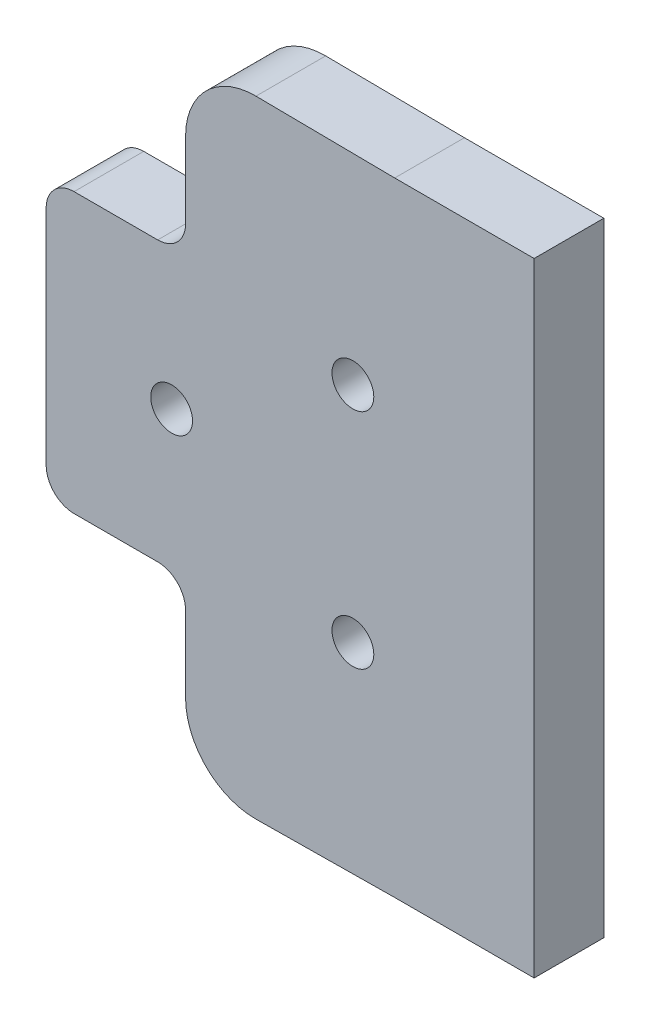
ISO-10303-21;
HEADER;
FILE_DESCRIPTION(('STEP AP214'),'2;1');
FILE_NAME('part.step','',(''),(''),'','','');
FILE_SCHEMA(('AUTOMOTIVE_DESIGN { 1 0 10303 214 1 1 1 1 }'));
ENDSEC;
DATA;
#1=APPLICATION_CONTEXT('core data for automotive mechanical design processes');
#2=APPLICATION_PROTOCOL_DEFINITION('international standard','automotive_design',2000,#1);
#3=PRODUCT_CONTEXT('',#1,'mechanical');
#4=PRODUCT('Part','Part','',(#3));
#5=PRODUCT_RELATED_PRODUCT_CATEGORY('part','',(#4));
#6=PRODUCT_DEFINITION_FORMATION('','',#4);
#7=PRODUCT_DEFINITION_CONTEXT('part definition',#1,'design');
#8=PRODUCT_DEFINITION('design','',#6,#7);
#9=PRODUCT_DEFINITION_SHAPE('','',#8);
#10=(LENGTH_UNIT() NAMED_UNIT(*) SI_UNIT(.MILLI.,.METRE.));
#11=(NAMED_UNIT(*) PLANE_ANGLE_UNIT() SI_UNIT($,.RADIAN.));
#12=(NAMED_UNIT(*) SI_UNIT($,.STERADIAN.) SOLID_ANGLE_UNIT());
#13=UNCERTAINTY_MEASURE_WITH_UNIT(LENGTH_MEASURE(1.E-05),#10,'distance_accuracy_value','');
#14=(GEOMETRIC_REPRESENTATION_CONTEXT(3) GLOBAL_UNCERTAINTY_ASSIGNED_CONTEXT((#13)) GLOBAL_UNIT_ASSIGNED_CONTEXT((#10,
#11,#12)) REPRESENTATION_CONTEXT('',''));
#15=CARTESIAN_POINT('',(0.,0.,0.));
#16=DIRECTION('',(0.,0.,1.));
#17=DIRECTION('',(1.,0.,0.));
#18=AXIS2_PLACEMENT_3D('',#15,#16,#17);
#19=CARTESIAN_POINT('',(6.08332870617352,-15.0357653278277,2.5));
#20=DIRECTION('',(0.,0.,-1.));
#21=DIRECTION('',(-1.,0.,0.));
#22=AXIS2_PLACEMENT_3D('',#19,#20,#21);
#23=CYLINDRICAL_SURFACE('',#22,5.);
#24=CARTESIAN_POINT('',(6.08332870617352,-15.0357653278277,-2.5));
#25=DIRECTION('',(0.,0.,1.));
#26=DIRECTION('',(1.,0.,0.));
#27=AXIS2_PLACEMENT_3D('',#24,#25,#26);
#28=CIRCLE('',#27,5.);
#29=CARTESIAN_POINT('',(1.08332870617352,-15.0357653278277,-2.5));
#30=VERTEX_POINT('',#29);
#31=CARTESIAN_POINT('',(6.13176798711662,-20.0355306859282,-2.5));
#32=VERTEX_POINT('',#31);
#33=EDGE_CURVE('E208',#30,#32,#28,.T.);
#34=ORIENTED_EDGE('',*,*,#33,.T.);
#35=DIRECTION('',(0.,0.,-1.));
#36=VECTOR('',#35,1.);
#37=CARTESIAN_POINT('',(6.13176798711662,-20.0355306859282,2.5));
#38=LINE('',#37,#36);
#39=CARTESIAN_POINT('',(6.13176798711662,-20.0355306859282,2.5));
#40=VERTEX_POINT('',#39);
#41=EDGE_CURVE('E11',#40,#32,#38,.T.);
#42=ORIENTED_EDGE('',*,*,#41,.F.);
#43=CARTESIAN_POINT('',(6.08332870617352,-15.0357653278277,2.5));
#44=DIRECTION('',(0.,0.,1.));
#45=DIRECTION('',(1.,0.,0.));
#46=AXIS2_PLACEMENT_3D('',#43,#44,#45);
#47=CIRCLE('',#46,5.);
#48=CARTESIAN_POINT('',(1.08332870617352,-15.0357653278277,2.5));
#49=VERTEX_POINT('',#48);
#50=EDGE_CURVE('E282',#49,#40,#47,.T.);
#51=ORIENTED_EDGE('',*,*,#50,.F.);
#52=DIRECTION('',(0.,0.,-1.));
#53=VECTOR('',#52,1.);
#54=CARTESIAN_POINT('',(1.08332870617352,-15.0357653278277,2.5));
#55=LINE('',#54,#53);
#56=EDGE_CURVE('E207',#49,#30,#55,.T.);
#57=ORIENTED_EDGE('',*,*,#56,.T.);
#58=EDGE_LOOP('',(#34,#42,#51,#57));
#59=FACE_BOUND('',#58,.T.);
#60=ADVANCED_FACE('F47',(#59),#23,.T.);
#61=CARTESIAN_POINT('',(6.13176798711678,-20.0355306859282,2.5));
#62=CARTESIAN_POINT('',(9.24809237704804,-20.0053387665437,2.5));
#63=CARTESIAN_POINT('',(12.5708327767224,-19.9685650530836,2.5));
#64=CARTESIAN_POINT('',(16.0833287061735,-19.9276262277099,2.5));
#65=B_SPLINE_CURVE_WITH_KNOTS('',3,(#61,#62,#63,#64),.UNSPECIFIED.,.F.,.F.,(4,4),
(0.0463279375915656,0.128883425378002),.UNSPECIFIED.);
#66=DIRECTION('',(0.,0.,-1.));
#67=VECTOR('',#66,1.);
#68=SURFACE_OF_LINEAR_EXTRUSION('',#65,#67);
#69=CARTESIAN_POINT('',(6.13176798711678,-20.0355306859282,-2.5));
#70=CARTESIAN_POINT('',(9.24809237704804,-20.0053387665437,-2.5));
#71=CARTESIAN_POINT('',(12.5708327767224,-19.9685650530836,-2.5));
#72=CARTESIAN_POINT('',(16.0833287061735,-19.9276262277099,-2.5));
#73=B_SPLINE_CURVE_WITH_KNOTS('',3,(#69,#70,#71,#72),.UNSPECIFIED.,.F.,.F.,(4,4),
(0.0463279375915656,0.128883425378002),.UNSPECIFIED.);
#74=CARTESIAN_POINT('',(16.0833287061735,-19.9276262277099,-2.5));
#75=VERTEX_POINT('',#74);
#76=EDGE_CURVE('E212',#32,#75,#73,.T.);
#77=ORIENTED_EDGE('',*,*,#76,.T.);
#78=DIRECTION('',(0.,0.,-1.));
#79=VECTOR('',#78,1.);
#80=CARTESIAN_POINT('',(16.0833287061735,-19.9276262277099,2.5));
#81=LINE('',#80,#79);
#82=CARTESIAN_POINT('',(16.0833287061735,-19.9276262277099,2.5));
#83=VERTEX_POINT('',#82);
#84=EDGE_CURVE('E56',#83,#75,#81,.T.);
#85=ORIENTED_EDGE('',*,*,#84,.F.);
#86=EDGE_CURVE('E127',#40,#83,#65,.T.);
#87=ORIENTED_EDGE('',*,*,#86,.F.);
#88=ORIENTED_EDGE('',*,*,#41,.T.);
#89=EDGE_LOOP('',(#77,#85,#87,#88));
#90=FACE_BOUND('',#89,.T.);
#91=ADVANCED_FACE('F380',(#90),#68,.F.);
#92=CARTESIAN_POINT('',(0.,-19.9276262277099,2.5));
#93=DIRECTION('',(0.,1.,0.));
#94=DIRECTION('',(-1.,0.,0.));
#95=AXIS2_PLACEMENT_3D('',#92,#93,#94);
#96=PLANE('',#95);
#97=DIRECTION('',(1.,0.,0.));
#98=VECTOR('',#97,1.);
#99=CARTESIAN_POINT('',(0.,-19.9276262277099,-2.5));
#100=LINE('',#99,#98);
#101=CARTESIAN_POINT('',(26.0833287061734,-19.9276262277099,-2.5));
#102=VERTEX_POINT('',#101);
#103=EDGE_CURVE('E217',#75,#102,#100,.T.);
#104=ORIENTED_EDGE('',*,*,#103,.T.);
#105=DIRECTION('',(0.,0.,-1.));
#106=VECTOR('',#105,1.);
#107=CARTESIAN_POINT('',(26.0833287061734,-19.9276262277099,2.5));
#108=LINE('',#107,#106);
#109=CARTESIAN_POINT('',(26.0833287061734,-19.9276262277099,2.5));
#110=VERTEX_POINT('',#109);
#111=EDGE_CURVE('E321',#110,#102,#108,.T.);
#112=ORIENTED_EDGE('',*,*,#111,.F.);
#113=DIRECTION('',(1.,0.,0.));
#114=VECTOR('',#113,1.);
#115=CARTESIAN_POINT('',(0.,-19.9276262277099,2.5));
#116=LINE('',#115,#114);
#117=EDGE_CURVE('E330',#83,#110,#116,.T.);
#118=ORIENTED_EDGE('',*,*,#117,.F.);
#119=ORIENTED_EDGE('',*,*,#84,.T.);
#120=EDGE_LOOP('',(#104,#112,#118,#119));
#121=FACE_BOUND('',#120,.T.);
#122=ADVANCED_FACE('F328',(#121),#96,.F.);
#123=CARTESIAN_POINT('',(26.0833287061734,0.,2.5));
#124=DIRECTION('',(1.,0.,0.));
#125=DIRECTION('',(0.,1.,0.));
#126=AXIS2_PLACEMENT_3D('',#123,#124,#125);
#127=PLANE('',#126);
#128=DIRECTION('',(0.,-1.,0.));
#129=VECTOR('',#128,1.);
#130=CARTESIAN_POINT('',(26.0833287061734,0.,-2.5));
#131=LINE('',#130,#129);
#132=CARTESIAN_POINT('',(26.0833287061734,24.7681978736312,-2.5));
#133=VERTEX_POINT('',#132);
#134=EDGE_CURVE('E224',#133,#102,#131,.T.);
#135=ORIENTED_EDGE('',*,*,#134,.F.);
#136=DIRECTION('',(0.,0.,-1.));
#137=VECTOR('',#136,1.);
#138=CARTESIAN_POINT('',(26.0833287061734,24.7681978736312,2.5));
#139=LINE('',#138,#137);
#140=CARTESIAN_POINT('',(26.0833287061734,24.7681978736312,2.5));
#141=VERTEX_POINT('',#140);
#142=EDGE_CURVE('E318',#141,#133,#139,.T.);
#143=ORIENTED_EDGE('',*,*,#142,.F.);
#144=DIRECTION('',(0.,-1.,0.));
#145=VECTOR('',#144,1.);
#146=CARTESIAN_POINT('',(26.0833287061734,0.,2.5));
#147=LINE('',#146,#145);
#148=EDGE_CURVE('E342',#141,#110,#147,.T.);
#149=ORIENTED_EDGE('',*,*,#148,.T.);
#150=ORIENTED_EDGE('',*,*,#111,.T.);
#151=EDGE_LOOP('',(#135,#143,#149,#150));
#152=FACE_BOUND('',#151,.T.);
#153=ADVANCED_FACE('F339',(#152),#127,.T.);
#154=CARTESIAN_POINT('',(0.,24.7681978736312,2.5));
#155=DIRECTION('',(0.,1.,0.));
#156=DIRECTION('',(0.,0.,1.));
#157=AXIS2_PLACEMENT_3D('',#154,#155,#156);
#158=PLANE('',#157);
#159=DIRECTION('',(1.,0.,0.));
#160=VECTOR('',#159,1.);
#161=CARTESIAN_POINT('',(0.,24.7681978736312,-2.5));
#162=LINE('',#161,#160);
#163=CARTESIAN_POINT('',(16.0833287061734,24.7681978736312,-2.5));
#164=VERTEX_POINT('',#163);
#165=EDGE_CURVE('E228',#164,#133,#162,.T.);
#166=ORIENTED_EDGE('',*,*,#165,.F.);
#167=DIRECTION('',(0.,0.,-1.));
#168=VECTOR('',#167,1.);
#169=CARTESIAN_POINT('',(16.0833287061734,24.7681978736312,2.5));
#170=LINE('',#169,#168);
#171=CARTESIAN_POINT('',(16.0833287061734,24.7681978736312,2.5));
#172=VERTEX_POINT('',#171);
#173=EDGE_CURVE('E315',#172,#164,#170,.T.);
#174=ORIENTED_EDGE('',*,*,#173,.F.);
#175=DIRECTION('',(1.,0.,0.));
#176=VECTOR('',#175,1.);
#177=CARTESIAN_POINT('',(0.,24.7681978736312,2.5));
#178=LINE('',#177,#176);
#179=EDGE_CURVE('E346',#172,#141,#178,.T.);
#180=ORIENTED_EDGE('',*,*,#179,.T.);
#181=ORIENTED_EDGE('',*,*,#142,.T.);
#182=EDGE_LOOP('',(#166,#174,#180,#181));
#183=FACE_BOUND('',#182,.T.);
#184=ADVANCED_FACE('F371',(#183),#158,.T.);
#185=CARTESIAN_POINT('',(16.0833287061734,24.7681978736312,2.5));
#186=CARTESIAN_POINT('',(12.5708327767225,24.8091366990049,2.5));
#187=CARTESIAN_POINT('',(9.24809237704841,24.8459104124651,2.5));
#188=CARTESIAN_POINT('',(6.13176798711737,24.8761023318496,2.5));
#189=B_SPLINE_CURVE_WITH_KNOTS('',3,(#185,#186,#187,#188),.UNSPECIFIED.,.F.,.F.,(4,4),
(0.0463279375915656,0.128883425377996),.UNSPECIFIED.);
#190=DIRECTION('',(0.,0.,-1.));
#191=VECTOR('',#190,1.);
#192=SURFACE_OF_LINEAR_EXTRUSION('',#189,#191);
#193=CARTESIAN_POINT('',(16.0833287061734,24.7681978736312,-2.5));
#194=CARTESIAN_POINT('',(12.5708327767225,24.8091366990049,-2.5));
#195=CARTESIAN_POINT('',(9.24809237704841,24.8459104124651,-2.5));
#196=CARTESIAN_POINT('',(6.13176798711737,24.8761023318496,-2.5));
#197=B_SPLINE_CURVE_WITH_KNOTS('',3,(#193,#194,#195,#196),.UNSPECIFIED.,.F.,.F.,(4,4),
(0.0463279375915656,0.128883425377996),.UNSPECIFIED.);
#198=CARTESIAN_POINT('',(6.13176798711737,24.8761023318496,-2.5));
#199=VERTEX_POINT('',#198);
#200=EDGE_CURVE('E232',#164,#199,#197,.T.);
#201=ORIENTED_EDGE('',*,*,#200,.T.);
#202=DIRECTION('',(0.,0.,-1.));
#203=VECTOR('',#202,1.);
#204=CARTESIAN_POINT('',(6.13176798711737,24.8761023318496,2.5));
#205=LINE('',#204,#203);
#206=CARTESIAN_POINT('',(6.13176798711737,24.8761023318496,2.5));
#207=VERTEX_POINT('',#206);
#208=EDGE_CURVE('E311',#207,#199,#205,.T.);
#209=ORIENTED_EDGE('',*,*,#208,.F.);
#210=EDGE_CURVE('E350',#172,#207,#189,.T.);
#211=ORIENTED_EDGE('',*,*,#210,.F.);
#212=ORIENTED_EDGE('',*,*,#173,.T.);
#213=EDGE_LOOP('',(#201,#209,#211,#212));
#214=FACE_BOUND('',#213,.T.);
#215=ADVANCED_FACE('F366',(#214),#192,.F.);
#216=CARTESIAN_POINT('',(6.08332870617352,19.8763369737491,2.5));
#217=DIRECTION('',(0.,0.,-1.));
#218=DIRECTION('',(-1.,0.,0.));
#219=AXIS2_PLACEMENT_3D('',#216,#217,#218);
#220=CYLINDRICAL_SURFACE('',#219,5.);
#221=CARTESIAN_POINT('',(6.08332870617352,19.8763369737491,-2.5));
#222=DIRECTION('',(0.,0.,1.));
#223=DIRECTION('',(1.,0.,0.));
#224=AXIS2_PLACEMENT_3D('',#221,#222,#223);
#225=CIRCLE('',#224,5.);
#226=CARTESIAN_POINT('',(1.08332870617352,19.8763369737491,-2.5));
#227=VERTEX_POINT('',#226);
#228=EDGE_CURVE('E237',#199,#227,#225,.T.);
#229=ORIENTED_EDGE('',*,*,#228,.T.);
#230=DIRECTION('',(0.,0.,-1.));
#231=VECTOR('',#230,1.);
#232=CARTESIAN_POINT('',(1.08332870617352,19.8763369737491,2.5));
#233=LINE('',#232,#231);
#234=CARTESIAN_POINT('',(1.08332870617352,19.8763369737491,2.5));
#235=VERTEX_POINT('',#234);
#236=EDGE_CURVE('E307',#235,#227,#233,.T.);
#237=ORIENTED_EDGE('',*,*,#236,.F.);
#238=CARTESIAN_POINT('',(6.08332870617352,19.8763369737491,2.5));
#239=DIRECTION('',(0.,0.,1.));
#240=DIRECTION('',(1.,0.,0.));
#241=AXIS2_PLACEMENT_3D('',#238,#239,#240);
#242=CIRCLE('',#241,5.);
#243=EDGE_CURVE('E360',#207,#235,#242,.T.);
#244=ORIENTED_EDGE('',*,*,#243,.F.);
#245=ORIENTED_EDGE('',*,*,#208,.T.);
#246=EDGE_LOOP('',(#229,#237,#244,#245));
#247=FACE_BOUND('',#246,.T.);
#248=ADVANCED_FACE('F370',(#247),#220,.T.);
#249=CARTESIAN_POINT('',(1.08332870617353,0.,2.5));
#250=DIRECTION('',(1.,0.,0.));
#251=DIRECTION('',(0.,1.,0.));
#252=AXIS2_PLACEMENT_3D('',#249,#250,#251);
#253=PLANE('',#252);
#254=DIRECTION('',(0.,-1.,0.));
#255=VECTOR('',#254,1.);
#256=CARTESIAN_POINT('',(1.08332870617353,0.,-2.5));
#257=LINE('',#256,#255);
#258=CARTESIAN_POINT('',(1.08332870617352,14.4202858229607,-2.5));
#259=VERTEX_POINT('',#258);
#260=EDGE_CURVE('E243',#227,#259,#257,.T.);
#261=ORIENTED_EDGE('',*,*,#260,.T.);
#262=DIRECTION('',(0.,0.,-1.));
#263=VECTOR('',#262,1.);
#264=CARTESIAN_POINT('',(1.08332870617352,14.4202858229607,2.5));
#265=LINE('',#264,#263);
#266=CARTESIAN_POINT('',(1.08332870617352,14.4202858229607,2.5));
#267=VERTEX_POINT('',#266);
#268=EDGE_CURVE('E304',#267,#259,#265,.T.);
#269=ORIENTED_EDGE('',*,*,#268,.F.);
#270=DIRECTION('',(0.,-1.,0.));
#271=VECTOR('',#270,1.);
#272=CARTESIAN_POINT('',(1.08332870617353,0.,2.5));
#273=LINE('',#272,#271);
#274=EDGE_CURVE('E430',#235,#267,#273,.T.);
#275=ORIENTED_EDGE('',*,*,#274,.F.);
#276=ORIENTED_EDGE('',*,*,#236,.T.);
#277=EDGE_LOOP('',(#261,#269,#275,#276));
#278=FACE_BOUND('',#277,.T.);
#279=ADVANCED_FACE('F423',(#278),#253,.F.);
#280=CARTESIAN_POINT('',(-0.916671293826477,14.4202858229607,2.5));
#281=DIRECTION('',(0.,0.,-1.));
#282=DIRECTION('',(-1.,0.,0.));
#283=AXIS2_PLACEMENT_3D('',#280,#281,#282);
#284=CYLINDRICAL_SURFACE('',#283,2.);
#285=CARTESIAN_POINT('',(-0.916671293826477,14.4202858229607,-2.5));
#286=DIRECTION('',(0.,0.,1.));
#287=DIRECTION('',(1.,0.,0.));
#288=AXIS2_PLACEMENT_3D('',#285,#286,#287);
#289=CIRCLE('',#288,2.);
#290=CARTESIAN_POINT('',(-0.916671293826478,12.4202858229607,-2.5));
#291=VERTEX_POINT('',#290);
#292=EDGE_CURVE('E247',#291,#259,#289,.T.);
#293=ORIENTED_EDGE('',*,*,#292,.F.);
#294=DIRECTION('',(0.,0.,-1.));
#295=VECTOR('',#294,1.);
#296=CARTESIAN_POINT('',(-0.916671293826478,12.4202858229607,2.5));
#297=LINE('',#296,#295);
#298=CARTESIAN_POINT('',(-0.916671293826478,12.4202858229607,2.5));
#299=VERTEX_POINT('',#298);
#300=EDGE_CURVE('E301',#299,#291,#297,.T.);
#301=ORIENTED_EDGE('',*,*,#300,.F.);
#302=CARTESIAN_POINT('',(-0.916671293826477,14.4202858229607,2.5));
#303=DIRECTION('',(0.,0.,1.));
#304=DIRECTION('',(1.,0.,0.));
#305=AXIS2_PLACEMENT_3D('',#302,#303,#304);
#306=CIRCLE('',#305,2.);
#307=EDGE_CURVE('E420',#299,#267,#306,.T.);
#308=ORIENTED_EDGE('',*,*,#307,.T.);
#309=ORIENTED_EDGE('',*,*,#268,.T.);
#310=EDGE_LOOP('',(#293,#301,#308,#309));
#311=FACE_BOUND('',#310,.T.);
#312=ADVANCED_FACE('F415',(#311),#284,.F.);
#313=CARTESIAN_POINT('',(0.,12.4202858229607,2.5));
#314=DIRECTION('',(0.,-1.,0.));
#315=DIRECTION('',(1.,0.,0.));
#316=AXIS2_PLACEMENT_3D('',#313,#314,#315);
#317=PLANE('',#316);
#318=DIRECTION('',(-1.,0.,0.));
#319=VECTOR('',#318,1.);
#320=CARTESIAN_POINT('',(0.,12.4202858229607,-2.5));
#321=LINE('',#320,#319);
#322=CARTESIAN_POINT('',(-6.91667129382647,12.4202858229607,-2.5));
#323=VERTEX_POINT('',#322);
#324=EDGE_CURVE('E251',#291,#323,#321,.T.);
#325=ORIENTED_EDGE('',*,*,#324,.T.);
#326=DIRECTION('',(0.,0.,-1.));
#327=VECTOR('',#326,1.);
#328=CARTESIAN_POINT('',(-6.91667129382647,12.4202858229607,2.5));
#329=LINE('',#328,#327);
#330=CARTESIAN_POINT('',(-6.91667129382647,12.4202858229607,2.5));
#331=VERTEX_POINT('',#330);
#332=EDGE_CURVE('E297',#331,#323,#329,.T.);
#333=ORIENTED_EDGE('',*,*,#332,.F.);
#334=DIRECTION('',(-1.,0.,0.));
#335=VECTOR('',#334,1.);
#336=CARTESIAN_POINT('',(0.,12.4202858229607,2.5));
#337=LINE('',#336,#335);
#338=EDGE_CURVE('E434',#299,#331,#337,.T.);
#339=ORIENTED_EDGE('',*,*,#338,.F.);
#340=ORIENTED_EDGE('',*,*,#300,.T.);
#341=EDGE_LOOP('',(#325,#333,#339,#340));
#342=FACE_BOUND('',#341,.T.);
#343=ADVANCED_FACE('F443',(#342),#317,.F.);
#344=CARTESIAN_POINT('',(-6.91667129382647,10.4202858229607,2.5));
#345=DIRECTION('',(0.,0.,-1.));
#346=DIRECTION('',(-1.,0.,0.));
#347=AXIS2_PLACEMENT_3D('',#344,#345,#346);
#348=CYLINDRICAL_SURFACE('',#347,2.);
#349=CARTESIAN_POINT('',(-6.91667129382647,10.4202858229607,-2.5));
#350=DIRECTION('',(0.,0.,1.));
#351=DIRECTION('',(1.,0.,0.));
#352=AXIS2_PLACEMENT_3D('',#349,#350,#351);
#353=CIRCLE('',#352,2.);
#354=CARTESIAN_POINT('',(-8.91667129382648,10.4202858229607,-2.5));
#355=VERTEX_POINT('',#354);
#356=EDGE_CURVE('E254',#323,#355,#353,.T.);
#357=ORIENTED_EDGE('',*,*,#356,.T.);
#358=DIRECTION('',(0.,0.,-1.));
#359=VECTOR('',#358,1.);
#360=CARTESIAN_POINT('',(-8.91667129382648,10.4202858229607,2.5));
#361=LINE('',#360,#359);
#362=CARTESIAN_POINT('',(-8.91667129382648,10.4202858229607,2.5));
#363=VERTEX_POINT('',#362);
#364=EDGE_CURVE('E293',#363,#355,#361,.T.);
#365=ORIENTED_EDGE('',*,*,#364,.F.);
#366=CARTESIAN_POINT('',(-6.91667129382647,10.4202858229607,2.5));
#367=DIRECTION('',(0.,0.,1.));
#368=DIRECTION('',(1.,0.,0.));
#369=AXIS2_PLACEMENT_3D('',#366,#367,#368);
#370=CIRCLE('',#369,2.);
#371=EDGE_CURVE('E408',#331,#363,#370,.T.);
#372=ORIENTED_EDGE('',*,*,#371,.F.);
#373=ORIENTED_EDGE('',*,*,#332,.T.);
#374=EDGE_LOOP('',(#357,#365,#372,#373));
#375=FACE_BOUND('',#374,.T.);
#376=ADVANCED_FACE('F407',(#375),#348,.T.);
#377=CARTESIAN_POINT('',(-8.91667129382647,0.,2.5));
#378=DIRECTION('',(1.,0.,0.));
#379=DIRECTION('',(0.,1.,0.));
#380=AXIS2_PLACEMENT_3D('',#377,#378,#379);
#381=PLANE('',#380);
#382=DIRECTION('',(0.,-1.,0.));
#383=VECTOR('',#382,1.);
#384=CARTESIAN_POINT('',(-8.91667129382647,0.,-2.5));
#385=LINE('',#384,#383);
#386=CARTESIAN_POINT('',(-8.91667129382647,-5.57971417703933,-2.5));
#387=VERTEX_POINT('',#386);
#388=EDGE_CURVE('E257',#355,#387,#385,.T.);
#389=ORIENTED_EDGE('',*,*,#388,.T.);
#390=DIRECTION('',(0.,0.,-1.));
#391=VECTOR('',#390,1.);
#392=CARTESIAN_POINT('',(-8.91667129382647,-5.57971417703933,2.5));
#393=LINE('',#392,#391);
#394=CARTESIAN_POINT('',(-8.91667129382647,-5.57971417703933,2.5));
#395=VERTEX_POINT('',#394);
#396=EDGE_CURVE('E289',#395,#387,#393,.T.);
#397=ORIENTED_EDGE('',*,*,#396,.F.);
#398=DIRECTION('',(0.,-1.,0.));
#399=VECTOR('',#398,1.);
#400=CARTESIAN_POINT('',(-8.91667129382647,0.,2.5));
#401=LINE('',#400,#399);
#402=EDGE_CURVE('E403',#363,#395,#401,.T.);
#403=ORIENTED_EDGE('',*,*,#402,.F.);
#404=ORIENTED_EDGE('',*,*,#364,.T.);
#405=EDGE_LOOP('',(#389,#397,#403,#404));
#406=FACE_BOUND('',#405,.T.);
#407=ADVANCED_FACE('F402',(#406),#381,.F.);
#408=CARTESIAN_POINT('',(-6.91667129382647,-5.57971417703933,2.5));
#409=DIRECTION('',(0.,0.,-1.));
#410=DIRECTION('',(-1.,0.,0.));
#411=AXIS2_PLACEMENT_3D('',#408,#409,#410);
#412=CYLINDRICAL_SURFACE('',#411,2.);
#413=CARTESIAN_POINT('',(-6.91667129382647,-5.57971417703933,-2.5));
#414=DIRECTION('',(0.,0.,1.));
#415=DIRECTION('',(1.,0.,0.));
#416=AXIS2_PLACEMENT_3D('',#413,#414,#415);
#417=CIRCLE('',#416,2.);
#418=CARTESIAN_POINT('',(-6.91667129382647,-7.57971417703933,-2.5));
#419=VERTEX_POINT('',#418);
#420=EDGE_CURVE('E260',#387,#419,#417,.T.);
#421=ORIENTED_EDGE('',*,*,#420,.T.);
#422=DIRECTION('',(0.,0.,-1.));
#423=VECTOR('',#422,1.);
#424=CARTESIAN_POINT('',(-6.91667129382647,-7.57971417703933,2.5));
#425=LINE('',#424,#423);
#426=CARTESIAN_POINT('',(-6.91667129382647,-7.57971417703933,2.5));
#427=VERTEX_POINT('',#426);
#428=EDGE_CURVE('E186',#427,#419,#425,.T.);
#429=ORIENTED_EDGE('',*,*,#428,.F.);
#430=CARTESIAN_POINT('',(-6.91667129382647,-5.57971417703933,2.5));
#431=DIRECTION('',(0.,0.,1.));
#432=DIRECTION('',(1.,0.,0.));
#433=AXIS2_PLACEMENT_3D('',#430,#431,#432);
#434=CIRCLE('',#433,2.);
#435=EDGE_CURVE('E171',#395,#427,#434,.T.);
#436=ORIENTED_EDGE('',*,*,#435,.F.);
#437=ORIENTED_EDGE('',*,*,#396,.T.);
#438=EDGE_LOOP('',(#421,#429,#436,#437));
#439=FACE_BOUND('',#438,.T.);
#440=ADVANCED_FACE('F398',(#439),#412,.T.);
#441=CARTESIAN_POINT('',(0.,-7.57971417703933,2.5));
#442=DIRECTION('',(0.,1.,0.));
#443=DIRECTION('',(-1.,0.,0.));
#444=AXIS2_PLACEMENT_3D('',#441,#442,#443);
#445=PLANE('',#444);
#446=DIRECTION('',(1.,0.,0.));
#447=VECTOR('',#446,1.);
#448=CARTESIAN_POINT('',(0.,-7.57971417703933,-2.5));
#449=LINE('',#448,#447);
#450=CARTESIAN_POINT('',(-0.916671293826478,-7.57971417703933,-2.5));
#451=VERTEX_POINT('',#450);
#452=EDGE_CURVE('E181',#419,#451,#449,.T.);
#453=ORIENTED_EDGE('',*,*,#452,.T.);
#454=DIRECTION('',(0.,0.,-1.));
#455=VECTOR('',#454,1.);
#456=CARTESIAN_POINT('',(-0.916671293826478,-7.57971417703933,2.5));
#457=LINE('',#456,#455);
#458=CARTESIAN_POINT('',(-0.916671293826478,-7.57971417703933,2.5));
#459=VERTEX_POINT('',#458);
#460=EDGE_CURVE('E178',#459,#451,#457,.T.);
#461=ORIENTED_EDGE('',*,*,#460,.F.);
#462=DIRECTION('',(1.,0.,0.));
#463=VECTOR('',#462,1.);
#464=CARTESIAN_POINT('',(0.,-7.57971417703933,2.5));
#465=LINE('',#464,#463);
#466=EDGE_CURVE('E164',#427,#459,#465,.T.);
#467=ORIENTED_EDGE('',*,*,#466,.F.);
#468=ORIENTED_EDGE('',*,*,#428,.T.);
#469=EDGE_LOOP('',(#453,#461,#467,#468));
#470=FACE_BOUND('',#469,.T.);
#471=ADVANCED_FACE('F179',(#470),#445,.F.);
#472=CARTESIAN_POINT('',(-0.916671293826477,-9.57971417703933,2.5));
#473=DIRECTION('',(0.,0.,-1.));
#474=DIRECTION('',(-1.,0.,0.));
#475=AXIS2_PLACEMENT_3D('',#472,#473,#474);
#476=CYLINDRICAL_SURFACE('',#475,2.);
#477=CARTESIAN_POINT('',(-0.916671293826477,-9.57971417703933,-2.5));
#478=DIRECTION('',(0.,0.,1.));
#479=DIRECTION('',(1.,0.,0.));
#480=AXIS2_PLACEMENT_3D('',#477,#478,#479);
#481=CIRCLE('',#480,2.);
#482=CARTESIAN_POINT('',(1.08332870617352,-9.57971417703933,-2.5));
#483=VERTEX_POINT('',#482);
#484=EDGE_CURVE('E265',#483,#451,#481,.T.);
#485=ORIENTED_EDGE('',*,*,#484,.F.);
#486=DIRECTION('',(0.,0.,-1.));
#487=VECTOR('',#486,1.);
#488=CARTESIAN_POINT('',(1.08332870617352,-9.57971417703933,2.5));
#489=LINE('',#488,#487);
#490=CARTESIAN_POINT('',(1.08332870617352,-9.57971417703933,2.5));
#491=VERTEX_POINT('',#490);
#492=EDGE_CURVE('E116',#491,#483,#489,.T.);
#493=ORIENTED_EDGE('',*,*,#492,.F.);
#494=CARTESIAN_POINT('',(-0.916671293826477,-9.57971417703933,2.5));
#495=DIRECTION('',(0.,0.,1.));
#496=DIRECTION('',(1.,0.,0.));
#497=AXIS2_PLACEMENT_3D('',#494,#495,#496);
#498=CIRCLE('',#497,2.);
#499=EDGE_CURVE('E169',#491,#459,#498,.T.);
#500=ORIENTED_EDGE('',*,*,#499,.T.);
#501=ORIENTED_EDGE('',*,*,#460,.T.);
#502=EDGE_LOOP('',(#485,#493,#500,#501));
#503=FACE_BOUND('',#502,.T.);
#504=ADVANCED_FACE('F188',(#503),#476,.F.);
#505=CARTESIAN_POINT('',(0.0833287061735299,2.42028582296067,2.5));
#506=DIRECTION('',(0.,0.,-1.));
#507=DIRECTION('',(-1.,0.,0.));
#508=AXIS2_PLACEMENT_3D('',#505,#506,#507);
#509=CYLINDRICAL_SURFACE('',#508,1.5);
#510=CARTESIAN_POINT('',(0.0833287061735299,2.42028582296067,2.5));
#511=DIRECTION('',(0.,0.,1.));
#512=DIRECTION('',(1.,0.,0.));
#513=AXIS2_PLACEMENT_3D('',#510,#511,#512);
#514=CIRCLE('',#513,1.5);
#515=CARTESIAN_POINT('',(1.58332870617353,2.42028582296067,2.5));
#516=VERTEX_POINT('',#515);
#517=EDGE_CURVE('E199',#516,#516,#514,.T.);
#518=ORIENTED_EDGE('',*,*,#517,.T.);
#519=EDGE_LOOP('',(#518));
#520=FACE_BOUND('',#519,.T.);
#521=CARTESIAN_POINT('',(0.0833287061735299,2.42028582296067,-2.5));
#522=DIRECTION('',(0.,0.,1.));
#523=DIRECTION('',(1.,0.,0.));
#524=AXIS2_PLACEMENT_3D('',#521,#522,#523);
#525=CIRCLE('',#524,1.5);
#526=CARTESIAN_POINT('',(1.58332870617353,2.42028582296067,-2.5));
#527=VERTEX_POINT('',#526);
#528=EDGE_CURVE('E274',#527,#527,#525,.T.);
#529=ORIENTED_EDGE('',*,*,#528,.F.);
#530=EDGE_LOOP('',(#529));
#531=FACE_BOUND('',#530,.T.);
#532=ADVANCED_FACE('F541',(#520,#531),#509,.F.);
#533=CARTESIAN_POINT('',(13.0833287061735,-5.57971417703933,2.5));
#534=DIRECTION('',(0.,0.,-1.));
#535=DIRECTION('',(-1.,0.,0.));
#536=AXIS2_PLACEMENT_3D('',#533,#534,#535);
#537=CYLINDRICAL_SURFACE('',#536,1.5);
#538=CARTESIAN_POINT('',(13.0833287061735,-5.57971417703933,2.5));
#539=DIRECTION('',(0.,0.,1.));
#540=DIRECTION('',(1.,0.,0.));
#541=AXIS2_PLACEMENT_3D('',#538,#539,#540);
#542=CIRCLE('',#541,1.5);
#543=CARTESIAN_POINT('',(14.5833287061735,-5.57971417703933,2.5));
#544=VERTEX_POINT('',#543);
#545=EDGE_CURVE('E192',#544,#544,#542,.T.);
#546=ORIENTED_EDGE('',*,*,#545,.T.);
#547=EDGE_LOOP('',(#546));
#548=FACE_BOUND('',#547,.T.);
#549=CARTESIAN_POINT('',(13.0833287061735,-5.57971417703933,-2.5));
#550=DIRECTION('',(0.,0.,1.));
#551=DIRECTION('',(1.,0.,0.));
#552=AXIS2_PLACEMENT_3D('',#549,#550,#551);
#553=CIRCLE('',#552,1.5);
#554=CARTESIAN_POINT('',(14.5833287061735,-5.57971417703933,-2.5));
#555=VERTEX_POINT('',#554);
#556=EDGE_CURVE('E270',#555,#555,#553,.T.);
#557=ORIENTED_EDGE('',*,*,#556,.F.);
#558=EDGE_LOOP('',(#557));
#559=FACE_BOUND('',#558,.T.);
#560=ADVANCED_FACE('F550',(#548,#559),#537,.F.);
#561=CARTESIAN_POINT('',(1.08332870617352,0.,2.5));
#562=DIRECTION('',(1.,0.,0.));
#563=DIRECTION('',(0.,1.,0.));
#564=AXIS2_PLACEMENT_3D('',#561,#562,#563);
#565=PLANE('',#564);
#566=DIRECTION('',(0.,-1.,0.));
#567=VECTOR('',#566,1.);
#568=CARTESIAN_POINT('',(1.08332870617352,0.,-2.5));
#569=LINE('',#568,#567);
#570=EDGE_CURVE('E119',#483,#30,#569,.T.);
#571=ORIENTED_EDGE('',*,*,#570,.T.);
#572=ORIENTED_EDGE('',*,*,#56,.F.);
#573=DIRECTION('',(0.,-1.,0.));
#574=VECTOR('',#573,1.);
#575=CARTESIAN_POINT('',(1.08332870617352,0.,2.5));
#576=LINE('',#575,#574);
#577=EDGE_CURVE('E64',#491,#49,#576,.T.);
#578=ORIENTED_EDGE('',*,*,#577,.F.);
#579=ORIENTED_EDGE('',*,*,#492,.T.);
#580=EDGE_LOOP('',(#571,#572,#578,#579));
#581=FACE_BOUND('',#580,.T.);
#582=ADVANCED_FACE('F560',(#581),#565,.F.);
#583=CARTESIAN_POINT('',(13.0833287061735,10.4202858229607,2.5));
#584=DIRECTION('',(0.,0.,-1.));
#585=DIRECTION('',(-1.,0.,0.));
#586=AXIS2_PLACEMENT_3D('',#583,#584,#585);
#587=CYLINDRICAL_SURFACE('',#586,1.5);
#588=CARTESIAN_POINT('',(13.0833287061735,10.4202858229607,2.5));
#589=DIRECTION('',(0.,0.,1.));
#590=DIRECTION('',(1.,0.,0.));
#591=AXIS2_PLACEMENT_3D('',#588,#589,#590);
#592=CIRCLE('',#591,1.5);
#593=CARTESIAN_POINT('',(14.5833287061735,10.4202858229607,2.5));
#594=VERTEX_POINT('',#593);
#595=EDGE_CURVE('E203',#594,#594,#592,.T.);
#596=ORIENTED_EDGE('',*,*,#595,.T.);
#597=EDGE_LOOP('',(#596));
#598=FACE_BOUND('',#597,.T.);
#599=CARTESIAN_POINT('',(13.0833287061735,10.4202858229607,-2.5));
#600=DIRECTION('',(0.,0.,1.));
#601=DIRECTION('',(1.,0.,0.));
#602=AXIS2_PLACEMENT_3D('',#599,#600,#601);
#603=CIRCLE('',#602,1.5);
#604=CARTESIAN_POINT('',(14.5833287061735,10.4202858229607,-2.5));
#605=VERTEX_POINT('',#604);
#606=EDGE_CURVE('E278',#605,#605,#603,.T.);
#607=ORIENTED_EDGE('',*,*,#606,.F.);
#608=EDGE_LOOP('',(#607));
#609=FACE_BOUND('',#608,.T.);
#610=ADVANCED_FACE('F570',(#598,#609),#587,.F.);
#611=CARTESIAN_POINT('',(0.,0.,2.5));
#612=DIRECTION('',(0.,0.,1.));
#613=DIRECTION('',(1.,0.,0.));
#614=AXIS2_PLACEMENT_3D('',#611,#612,#613);
#615=PLANE('',#614);
#616=ORIENTED_EDGE('',*,*,#50,.T.);
#617=ORIENTED_EDGE('',*,*,#86,.T.);
#618=ORIENTED_EDGE('',*,*,#117,.T.);
#619=ORIENTED_EDGE('',*,*,#148,.F.);
#620=ORIENTED_EDGE('',*,*,#179,.F.);
#621=ORIENTED_EDGE('',*,*,#210,.T.);
#622=ORIENTED_EDGE('',*,*,#243,.T.);
#623=ORIENTED_EDGE('',*,*,#274,.T.);
#624=ORIENTED_EDGE('',*,*,#307,.F.);
#625=ORIENTED_EDGE('',*,*,#338,.T.);
#626=ORIENTED_EDGE('',*,*,#371,.T.);
#627=ORIENTED_EDGE('',*,*,#402,.T.);
#628=ORIENTED_EDGE('',*,*,#435,.T.);
#629=ORIENTED_EDGE('',*,*,#466,.T.);
#630=ORIENTED_EDGE('',*,*,#499,.F.);
#631=ORIENTED_EDGE('',*,*,#577,.T.);
#632=EDGE_LOOP('',(#616,#617,#618,#619,#620,#621,#622,#623,#624,#625,#626,#627,#628,#629,#630,#631));
#633=FACE_BOUND('',#632,.T.);
#634=ORIENTED_EDGE('',*,*,#545,.F.);
#635=EDGE_LOOP('',(#634));
#636=FACE_BOUND('',#635,.T.);
#637=ORIENTED_EDGE('',*,*,#517,.F.);
#638=EDGE_LOOP('',(#637));
#639=FACE_BOUND('',#638,.T.);
#640=ORIENTED_EDGE('',*,*,#595,.F.);
#641=EDGE_LOOP('',(#640));
#642=FACE_BOUND('',#641,.T.);
#643=ADVANCED_FACE('F166',(#633,#636,#639,#642),#615,.T.);
#644=CARTESIAN_POINT('',(0.,0.,-2.5));
#645=DIRECTION('',(0.,0.,1.));
#646=DIRECTION('',(1.,0.,0.));
#647=AXIS2_PLACEMENT_3D('',#644,#645,#646);
#648=PLANE('',#647);
#649=ORIENTED_EDGE('',*,*,#33,.F.);
#650=ORIENTED_EDGE('',*,*,#570,.F.);
#651=ORIENTED_EDGE('',*,*,#484,.T.);
#652=ORIENTED_EDGE('',*,*,#452,.F.);
#653=ORIENTED_EDGE('',*,*,#420,.F.);
#654=ORIENTED_EDGE('',*,*,#388,.F.);
#655=ORIENTED_EDGE('',*,*,#356,.F.);
#656=ORIENTED_EDGE('',*,*,#324,.F.);
#657=ORIENTED_EDGE('',*,*,#292,.T.);
#658=ORIENTED_EDGE('',*,*,#260,.F.);
#659=ORIENTED_EDGE('',*,*,#228,.F.);
#660=ORIENTED_EDGE('',*,*,#200,.F.);
#661=ORIENTED_EDGE('',*,*,#165,.T.);
#662=ORIENTED_EDGE('',*,*,#134,.T.);
#663=ORIENTED_EDGE('',*,*,#103,.F.);
#664=ORIENTED_EDGE('',*,*,#76,.F.);
#665=EDGE_LOOP('',(#649,#650,#651,#652,#653,#654,#655,#656,#657,#658,#659,#660,#661,#662,#663,#664));
#666=FACE_BOUND('',#665,.T.);
#667=ORIENTED_EDGE('',*,*,#556,.T.);
#668=EDGE_LOOP('',(#667));
#669=FACE_BOUND('',#668,.T.);
#670=ORIENTED_EDGE('',*,*,#528,.T.);
#671=EDGE_LOOP('',(#670));
#672=FACE_BOUND('',#671,.T.);
#673=ORIENTED_EDGE('',*,*,#606,.T.);
#674=EDGE_LOOP('',(#673));
#675=FACE_BOUND('',#674,.T.);
#676=ADVANCED_FACE('F333',(#666,#669,#672,#675),#648,.F.);
#677=CLOSED_SHELL('',(#60,#91,#122,#153,#184,#215,#248,#279,#312,#343,#376,#407,#440,#471,#504,
#532,#560,#582,#610,#643,#676));
#678=MANIFOLD_SOLID_BREP('B2',#677);
#679=ADVANCED_BREP_SHAPE_REPRESENTATION('',(#18,#678),#14);
#680=SHAPE_DEFINITION_REPRESENTATION(#9,#679);
ENDSEC;
END-ISO-10303-21;
